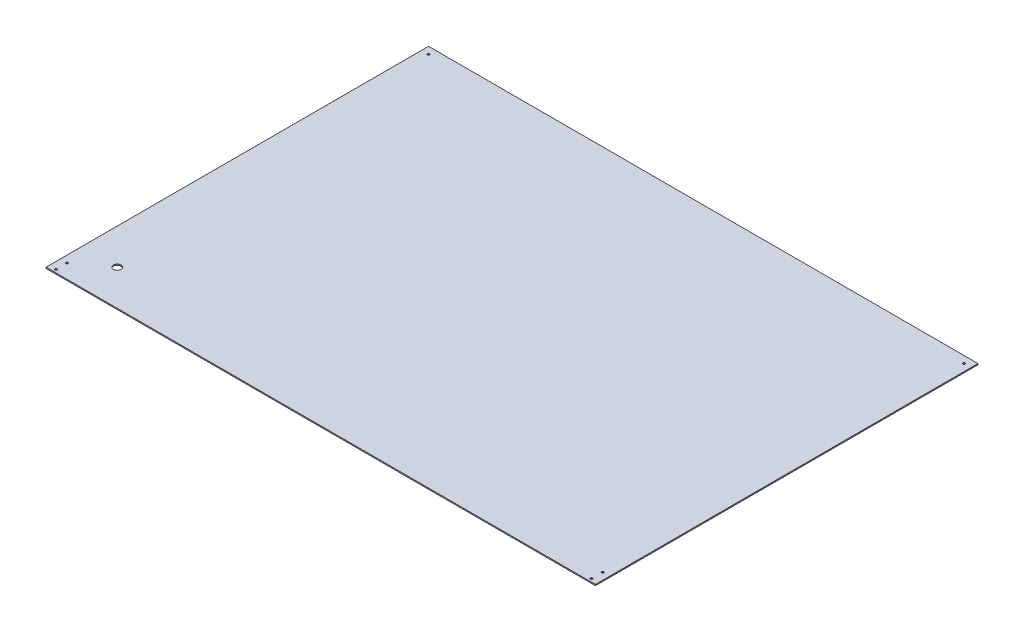
ISO-10303-21;
HEADER;
FILE_DESCRIPTION(('STEP AP214'),'2;1');
FILE_NAME('part.step','',(''),(''),'','','');
FILE_SCHEMA(('AUTOMOTIVE_DESIGN { 1 0 10303 214 1 1 1 1 }'));
ENDSEC;
DATA;
#1=APPLICATION_CONTEXT('core data for automotive mechanical design processes');
#2=APPLICATION_PROTOCOL_DEFINITION('international standard','automotive_design',2000,#1);
#3=PRODUCT_CONTEXT('',#1,'mechanical');
#4=PRODUCT('Part','Part','',(#3));
#5=PRODUCT_RELATED_PRODUCT_CATEGORY('part','',(#4));
#6=PRODUCT_DEFINITION_FORMATION('','',#4);
#7=PRODUCT_DEFINITION_CONTEXT('part definition',#1,'design');
#8=PRODUCT_DEFINITION('design','',#6,#7);
#9=PRODUCT_DEFINITION_SHAPE('','',#8);
#10=(LENGTH_UNIT() NAMED_UNIT(*) SI_UNIT(.MILLI.,.METRE.));
#11=(NAMED_UNIT(*) PLANE_ANGLE_UNIT() SI_UNIT($,.RADIAN.));
#12=(NAMED_UNIT(*) SI_UNIT($,.STERADIAN.) SOLID_ANGLE_UNIT());
#13=UNCERTAINTY_MEASURE_WITH_UNIT(LENGTH_MEASURE(1.E-05),#10,'distance_accuracy_value','');
#14=(GEOMETRIC_REPRESENTATION_CONTEXT(3) GLOBAL_UNCERTAINTY_ASSIGNED_CONTEXT((#13)) GLOBAL_UNIT_ASSIGNED_CONTEXT((#10,
#11,#12)) REPRESENTATION_CONTEXT('',''));
#15=CARTESIAN_POINT('',(0.,0.,0.));
#16=DIRECTION('',(0.,0.,1.));
#17=DIRECTION('',(1.,0.,0.));
#18=AXIS2_PLACEMENT_3D('',#15,#16,#17);
#19=CARTESIAN_POINT('',(-790.,-1.58749999999987,-550.));
#20=DIRECTION('',(0.,-1.,0.));
#21=DIRECTION('',(0.,0.,-1.));
#22=AXIS2_PLACEMENT_3D('',#19,#20,#21);
#23=PLANE('',#22);
#24=CARTESIAN_POINT('',(-770.,-1.5875,541.));
#25=DIRECTION('',(0.,-1.,0.));
#26=DIRECTION('',(0.,0.,-1.));
#27=AXIS2_PLACEMENT_3D('',#24,#25,#26);
#28=CIRCLE('',#27,3.17500000000008);
#29=CARTESIAN_POINT('',(-770.,-1.5875,537.825));
#30=VERTEX_POINT('',#29);
#31=EDGE_CURVE('E212',#30,#30,#28,.F.);
#32=ORIENTED_EDGE('',*,*,#31,.T.);
#33=EDGE_LOOP('',(#32));
#34=FACE_BOUND('',#33,.T.);
#35=CARTESIAN_POINT('',(-770.,-1.5875,509.));
#36=DIRECTION('',(0.,-1.,0.));
#37=DIRECTION('',(0.,0.,-1.));
#38=AXIS2_PLACEMENT_3D('',#35,#36,#37);
#39=CIRCLE('',#38,3.17500000000008);
#40=CARTESIAN_POINT('',(-770.,-1.58749999999999,505.825));
#41=VERTEX_POINT('',#40);
#42=EDGE_CURVE('E222',#41,#41,#39,.T.);
#43=ORIENTED_EDGE('',*,*,#42,.F.);
#44=EDGE_LOOP('',(#43));
#45=FACE_BOUND('',#44,.T.);
#46=CARTESIAN_POINT('',(-770.,-1.58749999999987,-530.));
#47=DIRECTION('',(0.,-1.,0.));
#48=DIRECTION('',(0.,0.,-1.));
#49=AXIS2_PLACEMENT_3D('',#46,#47,#48);
#50=CIRCLE('',#49,3.17500000000008);
#51=CARTESIAN_POINT('',(-770.,-1.58749999999987,-533.175));
#52=VERTEX_POINT('',#51);
#53=EDGE_CURVE('E138',#52,#52,#50,.T.);
#54=ORIENTED_EDGE('',*,*,#53,.F.);
#55=EDGE_LOOP('',(#54));
#56=FACE_BOUND('',#55,.T.);
#57=CARTESIAN_POINT('',(770.,-1.58749999999987,-530.000000000001));
#58=DIRECTION('',(0.,-1.,0.));
#59=DIRECTION('',(0.,0.,1.));
#60=AXIS2_PLACEMENT_3D('',#57,#58,#59);
#61=CIRCLE('',#60,3.17500000000008);
#62=CARTESIAN_POINT('',(770.,-1.58749999999987,-526.825000000001));
#63=VERTEX_POINT('',#62);
#64=EDGE_CURVE('E145',#63,#63,#61,.T.);
#65=ORIENTED_EDGE('',*,*,#64,.F.);
#66=EDGE_LOOP('',(#65));
#67=FACE_BOUND('',#66,.T.);
#68=CARTESIAN_POINT('',(-687.6,-1.58749999999999,447.6));
#69=DIRECTION('',(0.,-1.,0.));
#70=DIRECTION('',(0.,0.,-1.));
#71=AXIS2_PLACEMENT_3D('',#68,#69,#70);
#72=CIRCLE('',#71,11.);
#73=CARTESIAN_POINT('',(-687.6,-1.58749999999999,436.6));
#74=VERTEX_POINT('',#73);
#75=EDGE_CURVE('E110',#74,#74,#72,.T.);
#76=ORIENTED_EDGE('',*,*,#75,.F.);
#77=EDGE_LOOP('',(#76));
#78=FACE_BOUND('',#77,.T.);
#79=DIRECTION('',(1.,0.,0.));
#80=VECTOR('',#79,1.);
#81=CARTESIAN_POINT('',(-790.,-1.58749999999987,-550.));
#82=LINE('',#81,#80);
#83=CARTESIAN_POINT('',(-790.,-1.58749999999987,-550.));
#84=VERTEX_POINT('',#83);
#85=CARTESIAN_POINT('',(790.,-1.58749999999987,-550.));
#86=VERTEX_POINT('',#85);
#87=EDGE_CURVE('E11',#84,#86,#82,.T.);
#88=ORIENTED_EDGE('',*,*,#87,.T.);
#89=DIRECTION('',(0.,0.,-1.));
#90=VECTOR('',#89,1.);
#91=CARTESIAN_POINT('',(790.,-1.58749999999987,-550.));
#92=LINE('',#91,#90);
#93=CARTESIAN_POINT('',(790.,-1.5875,550.));
#94=VERTEX_POINT('',#93);
#95=EDGE_CURVE('E108',#94,#86,#92,.T.);
#96=ORIENTED_EDGE('',*,*,#95,.F.);
#97=DIRECTION('',(1.,0.,0.));
#98=VECTOR('',#97,1.);
#99=CARTESIAN_POINT('',(-790.,-1.5875,550.));
#100=LINE('',#99,#98);
#101=CARTESIAN_POINT('',(-790.,-1.5875,550.));
#102=VERTEX_POINT('',#101);
#103=EDGE_CURVE('E54',#102,#94,#100,.T.);
#104=ORIENTED_EDGE('',*,*,#103,.F.);
#105=DIRECTION('',(0.,0.,-1.));
#106=VECTOR('',#105,1.);
#107=CARTESIAN_POINT('',(-790.,-1.58749999999987,-550.));
#108=LINE('',#107,#106);
#109=EDGE_CURVE('E94',#102,#84,#108,.T.);
#110=ORIENTED_EDGE('',*,*,#109,.T.);
#111=EDGE_LOOP('',(#88,#96,#104,#110));
#112=FACE_BOUND('',#111,.T.);
#113=CARTESIAN_POINT('',(770.,-1.5875,541.));
#114=DIRECTION('',(0.,-1.,0.));
#115=DIRECTION('',(0.,0.,-1.));
#116=AXIS2_PLACEMENT_3D('',#113,#114,#115);
#117=CIRCLE('',#116,3.17500000000008);
#118=CARTESIAN_POINT('',(770.,-1.5875,537.825));
#119=VERTEX_POINT('',#118);
#120=EDGE_CURVE('E235',#119,#119,#117,.T.);
#121=ORIENTED_EDGE('',*,*,#120,.F.);
#122=EDGE_LOOP('',(#121));
#123=FACE_BOUND('',#122,.T.);
#124=CARTESIAN_POINT('',(770.,-1.5875,509.));
#125=DIRECTION('',(0.,-1.,0.));
#126=DIRECTION('',(0.,0.,-1.));
#127=AXIS2_PLACEMENT_3D('',#124,#125,#126);
#128=CIRCLE('',#127,3.17500000000008);
#129=CARTESIAN_POINT('',(770.,-1.58749999999999,505.825));
#130=VERTEX_POINT('',#129);
#131=EDGE_CURVE('E151',#130,#130,#128,.F.);
#132=ORIENTED_EDGE('',*,*,#131,.T.);
#133=EDGE_LOOP('',(#132));
#134=FACE_BOUND('',#133,.T.);
#135=ADVANCED_FACE('F44',(#34,#45,#56,#67,#78,#112,#123,#134),#23,.T.);
#136=CARTESIAN_POINT('',(-790.,1.5875,-550.));
#137=DIRECTION('',(0.,1.,0.));
#138=DIRECTION('',(0.,0.,1.));
#139=AXIS2_PLACEMENT_3D('',#136,#137,#138);
#140=PLANE('',#139);
#141=CARTESIAN_POINT('',(-770.,1.58749999999987,541.));
#142=DIRECTION('',(0.,1.,0.));
#143=DIRECTION('',(0.,0.,1.));
#144=AXIS2_PLACEMENT_3D('',#141,#142,#143);
#145=CIRCLE('',#144,3.17500000000008);
#146=CARTESIAN_POINT('',(-770.,1.58749999999987,544.175000000001));
#147=VERTEX_POINT('',#146);
#148=EDGE_CURVE('E214',#147,#147,#145,.F.);
#149=ORIENTED_EDGE('',*,*,#148,.T.);
#150=EDGE_LOOP('',(#149));
#151=FACE_BOUND('',#150,.T.);
#152=CARTESIAN_POINT('',(-770.,1.58749999999987,509.));
#153=DIRECTION('',(0.,1.,0.));
#154=DIRECTION('',(0.,0.,1.));
#155=AXIS2_PLACEMENT_3D('',#152,#153,#154);
#156=CIRCLE('',#155,3.17500000000008);
#157=CARTESIAN_POINT('',(-770.,1.58749999999987,512.175000000001));
#158=VERTEX_POINT('',#157);
#159=EDGE_CURVE('E216',#158,#158,#156,.T.);
#160=ORIENTED_EDGE('',*,*,#159,.F.);
#161=EDGE_LOOP('',(#160));
#162=FACE_BOUND('',#161,.T.);
#163=CARTESIAN_POINT('',(-770.,1.5875,-530.));
#164=DIRECTION('',(0.,1.,0.));
#165=DIRECTION('',(0.,0.,1.));
#166=AXIS2_PLACEMENT_3D('',#163,#164,#165);
#167=CIRCLE('',#166,3.17500000000008);
#168=CARTESIAN_POINT('',(-770.,1.5875,-526.825));
#169=VERTEX_POINT('',#168);
#170=EDGE_CURVE('E48',#169,#169,#167,.T.);
#171=ORIENTED_EDGE('',*,*,#170,.F.);
#172=EDGE_LOOP('',(#171));
#173=FACE_BOUND('',#172,.T.);
#174=CARTESIAN_POINT('',(770.,1.5875,-530.000000000001));
#175=DIRECTION('',(0.,1.,0.));
#176=DIRECTION('',(0.,0.,1.));
#177=AXIS2_PLACEMENT_3D('',#174,#175,#176);
#178=CIRCLE('',#177,3.17500000000008);
#179=CARTESIAN_POINT('',(770.,1.5875,-526.825000000001));
#180=VERTEX_POINT('',#179);
#181=EDGE_CURVE('E135',#180,#180,#178,.T.);
#182=ORIENTED_EDGE('',*,*,#181,.F.);
#183=EDGE_LOOP('',(#182));
#184=FACE_BOUND('',#183,.T.);
#185=CARTESIAN_POINT('',(-687.6,1.58749999999988,447.6));
#186=DIRECTION('',(0.,1.,0.));
#187=DIRECTION('',(0.,0.,1.));
#188=AXIS2_PLACEMENT_3D('',#185,#186,#187);
#189=CIRCLE('',#188,11.);
#190=CARTESIAN_POINT('',(-687.6,1.58749999999988,458.6));
#191=VERTEX_POINT('',#190);
#192=EDGE_CURVE('E114',#191,#191,#189,.T.);
#193=ORIENTED_EDGE('',*,*,#192,.F.);
#194=EDGE_LOOP('',(#193));
#195=FACE_BOUND('',#194,.T.);
#196=DIRECTION('',(1.,0.,0.));
#197=VECTOR('',#196,1.);
#198=CARTESIAN_POINT('',(-790.,1.58749999999987,550.));
#199=LINE('',#198,#197);
#200=CARTESIAN_POINT('',(-790.,1.58749999999987,550.));
#201=VERTEX_POINT('',#200);
#202=CARTESIAN_POINT('',(790.,1.58749999999987,550.));
#203=VERTEX_POINT('',#202);
#204=EDGE_CURVE('E93',#201,#203,#199,.T.);
#205=ORIENTED_EDGE('',*,*,#204,.T.);
#206=DIRECTION('',(0.,0.,1.));
#207=VECTOR('',#206,1.);
#208=CARTESIAN_POINT('',(790.,1.5875,-550.));
#209=LINE('',#208,#207);
#210=CARTESIAN_POINT('',(790.,1.5875,-550.));
#211=VERTEX_POINT('',#210);
#212=EDGE_CURVE('E97',#211,#203,#209,.T.);
#213=ORIENTED_EDGE('',*,*,#212,.F.);
#214=DIRECTION('',(1.,0.,0.));
#215=VECTOR('',#214,1.);
#216=CARTESIAN_POINT('',(-790.,1.5875,-550.));
#217=LINE('',#216,#215);
#218=CARTESIAN_POINT('',(-790.,1.5875,-550.));
#219=VERTEX_POINT('',#218);
#220=EDGE_CURVE('E84',#219,#211,#217,.T.);
#221=ORIENTED_EDGE('',*,*,#220,.F.);
#222=DIRECTION('',(0.,0.,1.));
#223=VECTOR('',#222,1.);
#224=CARTESIAN_POINT('',(-790.,1.5875,-550.));
#225=LINE('',#224,#223);
#226=EDGE_CURVE('E124',#219,#201,#225,.T.);
#227=ORIENTED_EDGE('',*,*,#226,.T.);
#228=EDGE_LOOP('',(#205,#213,#221,#227));
#229=FACE_BOUND('',#228,.T.);
#230=CARTESIAN_POINT('',(770.,1.58749999999987,541.));
#231=DIRECTION('',(0.,1.,0.));
#232=DIRECTION('',(0.,0.,1.));
#233=AXIS2_PLACEMENT_3D('',#230,#231,#232);
#234=CIRCLE('',#233,3.17500000000008);
#235=CARTESIAN_POINT('',(770.,1.58749999999987,544.175));
#236=VERTEX_POINT('',#235);
#237=EDGE_CURVE('E217',#236,#236,#234,.T.);
#238=ORIENTED_EDGE('',*,*,#237,.F.);
#239=EDGE_LOOP('',(#238));
#240=FACE_BOUND('',#239,.T.);
#241=CARTESIAN_POINT('',(770.,1.58749999999987,509.));
#242=DIRECTION('',(0.,-1.,0.));
#243=DIRECTION('',(0.,0.,-1.));
#244=AXIS2_PLACEMENT_3D('',#241,#242,#243);
#245=CIRCLE('',#244,3.17500000000008);
#246=CARTESIAN_POINT('',(770.,1.58749999999987,505.825));
#247=VERTEX_POINT('',#246);
#248=EDGE_CURVE('E225',#247,#247,#245,.T.);
#249=ORIENTED_EDGE('',*,*,#248,.T.);
#250=EDGE_LOOP('',(#249));
#251=FACE_BOUND('',#250,.T.);
#252=ADVANCED_FACE('F98',(#151,#162,#173,#184,#195,#229,#240,#251),#140,.T.);
#253=CARTESIAN_POINT('',(-790.,1.5875,-550.));
#254=DIRECTION('',(0.,0.,-1.));
#255=DIRECTION('',(-1.,0.,0.));
#256=AXIS2_PLACEMENT_3D('',#253,#254,#255);
#257=PLANE('',#256);
#258=ORIENTED_EDGE('',*,*,#220,.T.);
#259=DIRECTION('',(0.,1.,0.));
#260=VECTOR('',#259,1.);
#261=CARTESIAN_POINT('',(790.,1.5875,-550.));
#262=LINE('',#261,#260);
#263=EDGE_CURVE('E87',#86,#211,#262,.T.);
#264=ORIENTED_EDGE('',*,*,#263,.F.);
#265=ORIENTED_EDGE('',*,*,#87,.F.);
#266=DIRECTION('',(0.,1.,0.));
#267=VECTOR('',#266,1.);
#268=CARTESIAN_POINT('',(-790.,1.5875,-550.));
#269=LINE('',#268,#267);
#270=EDGE_CURVE('E88',#84,#219,#269,.T.);
#271=ORIENTED_EDGE('',*,*,#270,.T.);
#272=EDGE_LOOP('',(#258,#264,#265,#271));
#273=FACE_BOUND('',#272,.T.);
#274=ADVANCED_FACE('F46',(#273),#257,.T.);
#275=CARTESIAN_POINT('',(-790.,1.58749999999987,550.));
#276=DIRECTION('',(0.,0.,1.));
#277=DIRECTION('',(1.,0.,0.));
#278=AXIS2_PLACEMENT_3D('',#275,#276,#277);
#279=PLANE('',#278);
#280=ORIENTED_EDGE('',*,*,#103,.T.);
#281=DIRECTION('',(0.,-1.,0.));
#282=VECTOR('',#281,1.);
#283=CARTESIAN_POINT('',(790.,1.58749999999987,550.));
#284=LINE('',#283,#282);
#285=EDGE_CURVE('E104',#203,#94,#284,.T.);
#286=ORIENTED_EDGE('',*,*,#285,.F.);
#287=ORIENTED_EDGE('',*,*,#204,.F.);
#288=DIRECTION('',(0.,-1.,0.));
#289=VECTOR('',#288,1.);
#290=CARTESIAN_POINT('',(-790.,1.58749999999987,550.));
#291=LINE('',#290,#289);
#292=EDGE_CURVE('E127',#201,#102,#291,.T.);
#293=ORIENTED_EDGE('',*,*,#292,.T.);
#294=EDGE_LOOP('',(#280,#286,#287,#293));
#295=FACE_BOUND('',#294,.T.);
#296=ADVANCED_FACE('F168',(#295),#279,.T.);
#297=CARTESIAN_POINT('',(-790.,0.,0.));
#298=DIRECTION('',(-1.,0.,0.));
#299=DIRECTION('',(0.,0.,1.));
#300=AXIS2_PLACEMENT_3D('',#297,#298,#299);
#301=PLANE('',#300);
#302=ORIENTED_EDGE('',*,*,#270,.F.);
#303=ORIENTED_EDGE('',*,*,#109,.F.);
#304=ORIENTED_EDGE('',*,*,#292,.F.);
#305=ORIENTED_EDGE('',*,*,#226,.F.);
#306=EDGE_LOOP('',(#302,#303,#304,#305));
#307=FACE_BOUND('',#306,.T.);
#308=ADVANCED_FACE('F175',(#307),#301,.T.);
#309=CARTESIAN_POINT('',(790.,0.,0.));
#310=DIRECTION('',(-1.,0.,0.));
#311=DIRECTION('',(0.,0.,1.));
#312=AXIS2_PLACEMENT_3D('',#309,#310,#311);
#313=PLANE('',#312);
#314=ORIENTED_EDGE('',*,*,#263,.T.);
#315=ORIENTED_EDGE('',*,*,#212,.T.);
#316=ORIENTED_EDGE('',*,*,#285,.T.);
#317=ORIENTED_EDGE('',*,*,#95,.T.);
#318=EDGE_LOOP('',(#314,#315,#316,#317));
#319=FACE_BOUND('',#318,.T.);
#320=ADVANCED_FACE('F107',(#319),#313,.F.);
#321=CARTESIAN_POINT('',(-687.6,-8.41250000000012,447.6));
#322=DIRECTION('',(0.,1.,0.));
#323=DIRECTION('',(0.,0.,1.));
#324=AXIS2_PLACEMENT_3D('',#321,#322,#323);
#325=CYLINDRICAL_SURFACE('',#324,11.);
#326=ORIENTED_EDGE('',*,*,#75,.T.);
#327=EDGE_LOOP('',(#326));
#328=FACE_BOUND('',#327,.T.);
#329=ORIENTED_EDGE('',*,*,#192,.T.);
#330=EDGE_LOOP('',(#329));
#331=FACE_BOUND('',#330,.T.);
#332=ADVANCED_FACE('F159',(#328,#331),#325,.F.);
#333=CARTESIAN_POINT('',(770.,8.41250000000013,-530.000000000001));
#334=DIRECTION('',(0.,-1.,0.));
#335=DIRECTION('',(0.,0.,-1.));
#336=AXIS2_PLACEMENT_3D('',#333,#334,#335);
#337=CYLINDRICAL_SURFACE('',#336,3.17500000000008);
#338=ORIENTED_EDGE('',*,*,#181,.T.);
#339=EDGE_LOOP('',(#338));
#340=FACE_BOUND('',#339,.T.);
#341=ORIENTED_EDGE('',*,*,#64,.T.);
#342=EDGE_LOOP('',(#341));
#343=FACE_BOUND('',#342,.T.);
#344=ADVANCED_FACE('F185',(#340,#343),#337,.F.);
#345=CARTESIAN_POINT('',(-770.,8.41250000000013,-530.));
#346=DIRECTION('',(0.,-1.,0.));
#347=DIRECTION('',(0.,0.,-1.));
#348=AXIS2_PLACEMENT_3D('',#345,#346,#347);
#349=CYLINDRICAL_SURFACE('',#348,3.17500000000008);
#350=ORIENTED_EDGE('',*,*,#170,.T.);
#351=EDGE_LOOP('',(#350));
#352=FACE_BOUND('',#351,.T.);
#353=ORIENTED_EDGE('',*,*,#53,.T.);
#354=EDGE_LOOP('',(#353));
#355=FACE_BOUND('',#354,.T.);
#356=ADVANCED_FACE('F189',(#352,#355),#349,.F.);
#357=CARTESIAN_POINT('',(-770.,-8.41250000000013,509.));
#358=DIRECTION('',(0.,1.,0.));
#359=DIRECTION('',(0.,0.,1.));
#360=AXIS2_PLACEMENT_3D('',#357,#358,#359);
#361=CYLINDRICAL_SURFACE('',#360,3.17500000000008);
#362=ORIENTED_EDGE('',*,*,#42,.T.);
#363=EDGE_LOOP('',(#362));
#364=FACE_BOUND('',#363,.T.);
#365=ORIENTED_EDGE('',*,*,#159,.T.);
#366=EDGE_LOOP('',(#365));
#367=FACE_BOUND('',#366,.T.);
#368=ADVANCED_FACE('F192',(#364,#367),#361,.F.);
#369=CARTESIAN_POINT('',(-770.,-8.41250000000013,541.));
#370=DIRECTION('',(0.,1.,0.));
#371=DIRECTION('',(0.,0.,1.));
#372=AXIS2_PLACEMENT_3D('',#369,#370,#371);
#373=CYLINDRICAL_SURFACE('',#372,3.17500000000008);
#374=ORIENTED_EDGE('',*,*,#31,.F.);
#375=EDGE_LOOP('',(#374));
#376=FACE_BOUND('',#375,.T.);
#377=ORIENTED_EDGE('',*,*,#148,.F.);
#378=EDGE_LOOP('',(#377));
#379=FACE_BOUND('',#378,.T.);
#380=ADVANCED_FACE('F195',(#376,#379),#373,.F.);
#381=CARTESIAN_POINT('',(770.,-8.41250000000013,541.));
#382=DIRECTION('',(0.,1.,0.));
#383=DIRECTION('',(0.,0.,1.));
#384=AXIS2_PLACEMENT_3D('',#381,#382,#383);
#385=CYLINDRICAL_SURFACE('',#384,3.17500000000008);
#386=ORIENTED_EDGE('',*,*,#120,.T.);
#387=EDGE_LOOP('',(#386));
#388=FACE_BOUND('',#387,.T.);
#389=ORIENTED_EDGE('',*,*,#237,.T.);
#390=EDGE_LOOP('',(#389));
#391=FACE_BOUND('',#390,.T.);
#392=ADVANCED_FACE('F200',(#388,#391),#385,.F.);
#393=CARTESIAN_POINT('',(770.,-8.41250000000013,509.));
#394=DIRECTION('',(0.,1.,0.));
#395=DIRECTION('',(0.,0.,1.));
#396=AXIS2_PLACEMENT_3D('',#393,#394,#395);
#397=CYLINDRICAL_SURFACE('',#396,3.17500000000008);
#398=ORIENTED_EDGE('',*,*,#131,.F.);
#399=EDGE_LOOP('',(#398));
#400=FACE_BOUND('',#399,.T.);
#401=ORIENTED_EDGE('',*,*,#248,.F.);
#402=EDGE_LOOP('',(#401));
#403=FACE_BOUND('',#402,.T.);
#404=ADVANCED_FACE('F197',(#400,#403),#397,.F.);
#405=CLOSED_SHELL('',(#135,#252,#274,#296,#308,#320,#332,#344,#356,#368,#380,#392,#404));
#406=MANIFOLD_SOLID_BREP('B2',#405);
#407=ADVANCED_BREP_SHAPE_REPRESENTATION('',(#18,#406),#14);
#408=SHAPE_DEFINITION_REPRESENTATION(#9,#407);
ENDSEC;
END-ISO-10303-21;
